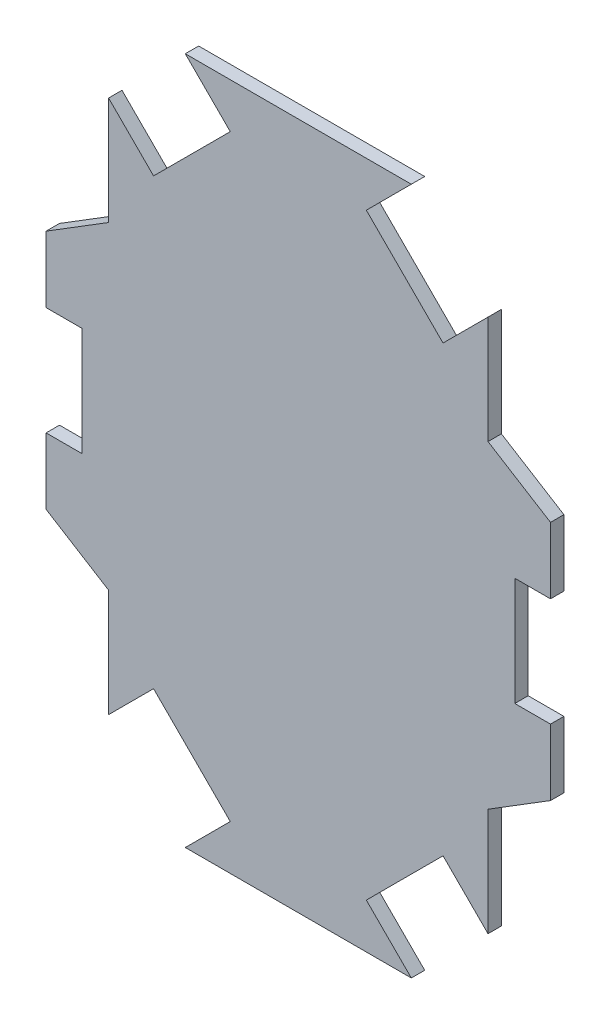
ISO-10303-21;
HEADER;
FILE_DESCRIPTION(('STEP AP214'),'2;1');
FILE_NAME('part.step','',(''),(''),'','','');
FILE_SCHEMA(('AUTOMOTIVE_DESIGN { 1 0 10303 214 1 1 1 1 }'));
ENDSEC;
DATA;
#1=APPLICATION_CONTEXT('core data for automotive mechanical design processes');
#2=APPLICATION_PROTOCOL_DEFINITION('international standard','automotive_design',2000,#1);
#3=PRODUCT_CONTEXT('',#1,'mechanical');
#4=PRODUCT('Part','Part','',(#3));
#5=PRODUCT_RELATED_PRODUCT_CATEGORY('part','',(#4));
#6=PRODUCT_DEFINITION_FORMATION('','',#4);
#7=PRODUCT_DEFINITION_CONTEXT('part definition',#1,'design');
#8=PRODUCT_DEFINITION('design','',#6,#7);
#9=PRODUCT_DEFINITION_SHAPE('','',#8);
#10=(LENGTH_UNIT() NAMED_UNIT(*) SI_UNIT(.MILLI.,.METRE.));
#11=(NAMED_UNIT(*) PLANE_ANGLE_UNIT() SI_UNIT($,.RADIAN.));
#12=(NAMED_UNIT(*) SI_UNIT($,.STERADIAN.) SOLID_ANGLE_UNIT());
#13=UNCERTAINTY_MEASURE_WITH_UNIT(LENGTH_MEASURE(1.E-05),#10,'distance_accuracy_value','');
#14=(GEOMETRIC_REPRESENTATION_CONTEXT(3) GLOBAL_UNCERTAINTY_ASSIGNED_CONTEXT((#13)) GLOBAL_UNIT_ASSIGNED_CONTEXT((#10,
#11,#12)) REPRESENTATION_CONTEXT('',''));
#15=CARTESIAN_POINT('',(0.,0.,0.));
#16=DIRECTION('',(0.,0.,1.));
#17=DIRECTION('',(1.,0.,0.));
#18=AXIS2_PLACEMENT_3D('',#15,#16,#17);
#19=CARTESIAN_POINT('',(99.,-50.0114282123653,0.));
#20=DIRECTION('',(1.,0.,0.));
#21=DIRECTION('',(0.,1.,0.));
#22=AXIS2_PLACEMENT_3D('',#19,#20,#21);
#23=PLANE('',#22);
#24=DIRECTION('',(0.,0.,1.));
#25=VECTOR('',#24,1.);
#26=CARTESIAN_POINT('',(99.,-64.85,0.));
#27=LINE('',#26,#25);
#28=CARTESIAN_POINT('',(99.,-64.85,0.));
#29=VERTEX_POINT('',#28);
#30=CARTESIAN_POINT('',(99.,-64.85,3.));
#31=VERTEX_POINT('',#30);
#32=EDGE_CURVE('E488',#29,#31,#27,.T.);
#33=ORIENTED_EDGE('',*,*,#32,.F.);
#34=DIRECTION('',(0.,1.,0.));
#35=VECTOR('',#34,1.);
#36=CARTESIAN_POINT('',(99.,-50.0114282123653,0.));
#37=LINE('',#36,#35);
#38=CARTESIAN_POINT('',(99.,-50.0114282123653,0.));
#39=VERTEX_POINT('',#38);
#40=EDGE_CURVE('E322',#29,#39,#37,.T.);
#41=ORIENTED_EDGE('',*,*,#40,.T.);
#42=DIRECTION('',(0.,0.,1.));
#43=VECTOR('',#42,1.);
#44=CARTESIAN_POINT('',(99.,-50.0114282123653,0.));
#45=LINE('',#44,#43);
#46=CARTESIAN_POINT('',(99.,-50.0114282123653,3.));
#47=VERTEX_POINT('',#46);
#48=EDGE_CURVE('E338',#39,#47,#45,.T.);
#49=ORIENTED_EDGE('',*,*,#48,.T.);
#50=DIRECTION('',(0.,1.,0.));
#51=VECTOR('',#50,1.);
#52=CARTESIAN_POINT('',(99.,-50.0114282123653,3.));
#53=LINE('',#52,#51);
#54=EDGE_CURVE('E331',#31,#47,#53,.T.);
#55=ORIENTED_EDGE('',*,*,#54,.F.);
#56=EDGE_LOOP('',(#33,#41,#49,#55));
#57=FACE_BOUND('',#56,.T.);
#58=ADVANCED_FACE('F35',(#57),#23,.T.);
#59=CARTESIAN_POINT('',(-14.,-50.0114282123653,0.));
#60=DIRECTION('',(-1.,0.,0.));
#61=DIRECTION('',(0.,0.,1.));
#62=AXIS2_PLACEMENT_3D('',#59,#60,#61);
#63=PLANE('',#62);
#64=DIRECTION('',(0.,0.,-1.));
#65=VECTOR('',#64,1.);
#66=CARTESIAN_POINT('',(-14.,-64.85,0.));
#67=LINE('',#66,#65);
#68=CARTESIAN_POINT('',(-14.,-64.85,3.));
#69=VERTEX_POINT('',#68);
#70=CARTESIAN_POINT('',(-14.,-64.85,0.));
#71=VERTEX_POINT('',#70);
#72=EDGE_CURVE('E484',#69,#71,#67,.T.);
#73=ORIENTED_EDGE('',*,*,#72,.F.);
#74=DIRECTION('',(0.,-1.,0.));
#75=VECTOR('',#74,1.);
#76=CARTESIAN_POINT('',(-14.,-50.0114282123653,3.));
#77=LINE('',#76,#75);
#78=CARTESIAN_POINT('',(-14.,-50.0114282123653,3.));
#79=VERTEX_POINT('',#78);
#80=EDGE_CURVE('E300',#79,#69,#77,.T.);
#81=ORIENTED_EDGE('',*,*,#80,.F.);
#82=DIRECTION('',(0.,0.,1.));
#83=VECTOR('',#82,1.);
#84=CARTESIAN_POINT('',(-14.,-50.0114282123653,0.));
#85=LINE('',#84,#83);
#86=CARTESIAN_POINT('',(-14.,-50.0114282123653,0.));
#87=VERTEX_POINT('',#86);
#88=EDGE_CURVE('E309',#87,#79,#85,.T.);
#89=ORIENTED_EDGE('',*,*,#88,.F.);
#90=DIRECTION('',(0.,-1.,0.));
#91=VECTOR('',#90,1.);
#92=CARTESIAN_POINT('',(-14.,-50.0114282123653,0.));
#93=LINE('',#92,#91);
#94=EDGE_CURVE('E290',#87,#71,#93,.T.);
#95=ORIENTED_EDGE('',*,*,#94,.T.);
#96=EDGE_LOOP('',(#73,#81,#89,#95));
#97=FACE_BOUND('',#96,.T.);
#98=ADVANCED_FACE('F508',(#97),#63,.T.);
#99=CARTESIAN_POINT('',(0.,0.,3.));
#100=DIRECTION('',(1.,0.,0.));
#101=DIRECTION('',(0.,1.,0.));
#102=AXIS2_PLACEMENT_3D('',#99,#100,#101);
#103=PLANE('',#102);
#104=DIRECTION('',(0.,0.,1.));
#105=VECTOR('',#104,1.);
#106=CARTESIAN_POINT('',(0.,-112.665382133312,0.));
#107=LINE('',#106,#105);
#108=CARTESIAN_POINT('',(0.,-112.665382133312,0.));
#109=VERTEX_POINT('',#108);
#110=CARTESIAN_POINT('',(0.,-112.665382133312,3.));
#111=VERTEX_POINT('',#110);
#112=EDGE_CURVE('E315',#109,#111,#107,.T.);
#113=ORIENTED_EDGE('',*,*,#112,.F.);
#114=DIRECTION('',(0.,-1.,0.));
#115=VECTOR('',#114,1.);
#116=CARTESIAN_POINT('',(0.,0.,0.));
#117=LINE('',#116,#115);
#118=CARTESIAN_POINT('',(0.,-136.817305217167,0.));
#119=VERTEX_POINT('',#118);
#120=EDGE_CURVE('E418',#109,#119,#117,.T.);
#121=ORIENTED_EDGE('',*,*,#120,.T.);
#122=DIRECTION('',(0.,0.,1.));
#123=VECTOR('',#122,1.);
#124=CARTESIAN_POINT('',(0.,-136.817305217167,3.));
#125=LINE('',#124,#123);
#126=CARTESIAN_POINT('',(0.,-136.817305217167,3.));
#127=VERTEX_POINT('',#126);
#128=EDGE_CURVE('E415',#119,#127,#125,.T.);
#129=ORIENTED_EDGE('',*,*,#128,.T.);
#130=DIRECTION('',(0.,-1.,0.));
#131=VECTOR('',#130,1.);
#132=CARTESIAN_POINT('',(0.,0.,3.));
#133=LINE('',#132,#131);
#134=EDGE_CURVE('E423',#111,#127,#133,.T.);
#135=ORIENTED_EDGE('',*,*,#134,.F.);
#136=EDGE_LOOP('',(#113,#121,#129,#135));
#137=FACE_BOUND('',#136,.T.);
#138=ADVANCED_FACE('F598',(#137),#103,.F.);
#139=CARTESIAN_POINT('',(85.,0.,3.));
#140=DIRECTION('',(-1.,0.,0.));
#141=DIRECTION('',(0.,-1.,0.));
#142=AXIS2_PLACEMENT_3D('',#139,#140,#141);
#143=PLANE('',#142);
#144=DIRECTION('',(0.,0.,1.));
#145=VECTOR('',#144,1.);
#146=CARTESIAN_POINT('',(85.,-41.3346178666883,0.));
#147=LINE('',#146,#145);
#148=CARTESIAN_POINT('',(85.,-41.3346178666883,0.));
#149=VERTEX_POINT('',#148);
#150=CARTESIAN_POINT('',(85.,-41.3346178666883,3.));
#151=VERTEX_POINT('',#150);
#152=EDGE_CURVE('E335',#149,#151,#147,.T.);
#153=ORIENTED_EDGE('',*,*,#152,.F.);
#154=DIRECTION('',(0.,1.,0.));
#155=VECTOR('',#154,1.);
#156=CARTESIAN_POINT('',(85.,0.,0.));
#157=LINE('',#156,#155);
#158=CARTESIAN_POINT('',(85.,-17.1826947828331,0.));
#159=VERTEX_POINT('',#158);
#160=EDGE_CURVE('E440',#149,#159,#157,.T.);
#161=ORIENTED_EDGE('',*,*,#160,.T.);
#162=DIRECTION('',(0.,0.,1.));
#163=VECTOR('',#162,1.);
#164=CARTESIAN_POINT('',(85.,-17.1826947828331,3.));
#165=LINE('',#164,#163);
#166=CARTESIAN_POINT('',(85.,-17.1826947828331,3.));
#167=VERTEX_POINT('',#166);
#168=EDGE_CURVE('E403',#159,#167,#165,.T.);
#169=ORIENTED_EDGE('',*,*,#168,.T.);
#170=DIRECTION('',(0.,1.,0.));
#171=VECTOR('',#170,1.);
#172=CARTESIAN_POINT('',(85.,0.,3.));
#173=LINE('',#172,#171);
#174=EDGE_CURVE('E426',#151,#167,#173,.T.);
#175=ORIENTED_EDGE('',*,*,#174,.F.);
#176=EDGE_LOOP('',(#153,#161,#169,#175));
#177=FACE_BOUND('',#176,.T.);
#178=ADVANCED_FACE('F546',(#177),#143,.F.);
#179=CARTESIAN_POINT('',(0.,-17.1826947828331,0.));
#180=VERTEX_POINT('',#179);
#181=CARTESIAN_POINT('',(0.,-41.3346178666882,0.));
#182=VERTEX_POINT('',#181);
#183=EDGE_CURVE('E434',#180,#182,#117,.T.);
#184=ORIENTED_EDGE('',*,*,#183,.T.);
#185=DIRECTION('',(0.,0.,1.));
#186=VECTOR('',#185,1.);
#187=CARTESIAN_POINT('',(0.,-41.3346178666882,0.));
#188=LINE('',#187,#186);
#189=CARTESIAN_POINT('',(0.,-41.3346178666882,3.));
#190=VERTEX_POINT('',#189);
#191=EDGE_CURVE('E312',#182,#190,#188,.T.);
#192=ORIENTED_EDGE('',*,*,#191,.T.);
#193=CARTESIAN_POINT('',(0.,-17.1826947828331,3.));
#194=VERTEX_POINT('',#193);
#195=EDGE_CURVE('E419',#194,#190,#133,.T.);
#196=ORIENTED_EDGE('',*,*,#195,.F.);
#197=DIRECTION('',(0.,0.,-1.));
#198=VECTOR('',#197,1.);
#199=CARTESIAN_POINT('',(0.,-17.1826947828331,3.));
#200=LINE('',#199,#198);
#201=EDGE_CURVE('E393',#194,#180,#200,.T.);
#202=ORIENTED_EDGE('',*,*,#201,.T.);
#203=EDGE_LOOP('',(#184,#192,#196,#202));
#204=FACE_BOUND('',#203,.T.);
#205=ADVANCED_FACE('F37',(#204),#103,.F.);
#206=CARTESIAN_POINT('',(0.,-154.,3.));
#207=DIRECTION('',(0.,1.,0.));
#208=DIRECTION('',(0.,0.,1.));
#209=AXIS2_PLACEMENT_3D('',#206,#207,#208);
#210=PLANE('',#209);
#211=DIRECTION('',(1.,0.,0.));
#212=VECTOR('',#211,1.);
#213=CARTESIAN_POINT('',(0.,-154.,3.));
#214=LINE('',#213,#212);
#215=CARTESIAN_POINT('',(17.1826947828331,-154.,3.));
#216=VERTEX_POINT('',#215);
#217=CARTESIAN_POINT('',(67.8173052171669,-154.,3.));
#218=VERTEX_POINT('',#217);
#219=EDGE_CURVE('E422',#216,#218,#214,.T.);
#220=ORIENTED_EDGE('',*,*,#219,.F.);
#221=DIRECTION('',(0.,0.,-1.));
#222=VECTOR('',#221,1.);
#223=CARTESIAN_POINT('',(17.1826947828331,-154.,3.));
#224=LINE('',#223,#222);
#225=CARTESIAN_POINT('',(17.1826947828331,-154.,0.));
#226=VERTEX_POINT('',#225);
#227=EDGE_CURVE('E412',#216,#226,#224,.T.);
#228=ORIENTED_EDGE('',*,*,#227,.T.);
#229=DIRECTION('',(1.,0.,0.));
#230=VECTOR('',#229,1.);
#231=CARTESIAN_POINT('',(0.,-154.,0.));
#232=LINE('',#231,#230);
#233=CARTESIAN_POINT('',(67.8173052171669,-154.,0.));
#234=VERTEX_POINT('',#233);
#235=EDGE_CURVE('E437',#226,#234,#232,.T.);
#236=ORIENTED_EDGE('',*,*,#235,.T.);
#237=DIRECTION('',(0.,0.,1.));
#238=VECTOR('',#237,1.);
#239=CARTESIAN_POINT('',(67.8173052171669,-154.,3.));
#240=LINE('',#239,#238);
#241=EDGE_CURVE('E406',#234,#218,#240,.T.);
#242=ORIENTED_EDGE('',*,*,#241,.T.);
#243=EDGE_LOOP('',(#220,#228,#236,#242));
#244=FACE_BOUND('',#243,.T.);
#245=ADVANCED_FACE('F580',(#244),#210,.F.);
#246=CARTESIAN_POINT('',(85.,-136.817305217167,0.));
#247=VERTEX_POINT('',#246);
#248=CARTESIAN_POINT('',(85.,-112.665382133312,0.));
#249=VERTEX_POINT('',#248);
#250=EDGE_CURVE('E441',#247,#249,#157,.T.);
#251=ORIENTED_EDGE('',*,*,#250,.T.);
#252=DIRECTION('',(0.,0.,1.));
#253=VECTOR('',#252,1.);
#254=CARTESIAN_POINT('',(85.,-112.665382133312,0.));
#255=LINE('',#254,#253);
#256=CARTESIAN_POINT('',(85.,-112.665382133312,3.));
#257=VERTEX_POINT('',#256);
#258=EDGE_CURVE('E329',#249,#257,#255,.T.);
#259=ORIENTED_EDGE('',*,*,#258,.T.);
#260=CARTESIAN_POINT('',(85.,-136.817305217167,3.));
#261=VERTEX_POINT('',#260);
#262=EDGE_CURVE('E427',#261,#257,#173,.T.);
#263=ORIENTED_EDGE('',*,*,#262,.F.);
#264=DIRECTION('',(0.,0.,-1.));
#265=VECTOR('',#264,1.);
#266=CARTESIAN_POINT('',(85.,-136.817305217167,3.));
#267=LINE('',#266,#265);
#268=EDGE_CURVE('E409',#261,#247,#267,.T.);
#269=ORIENTED_EDGE('',*,*,#268,.T.);
#270=EDGE_LOOP('',(#251,#259,#263,#269));
#271=FACE_BOUND('',#270,.T.);
#272=ADVANCED_FACE('F565',(#271),#143,.F.);
#273=CARTESIAN_POINT('',(0.,0.,3.));
#274=DIRECTION('',(0.,-1.,0.));
#275=DIRECTION('',(0.,0.,-1.));
#276=AXIS2_PLACEMENT_3D('',#273,#274,#275);
#277=PLANE('',#276);
#278=DIRECTION('',(-1.,0.,0.));
#279=VECTOR('',#278,1.);
#280=CARTESIAN_POINT('',(0.,0.,3.));
#281=LINE('',#280,#279);
#282=CARTESIAN_POINT('',(67.8173052171669,0.,3.));
#283=VERTEX_POINT('',#282);
#284=CARTESIAN_POINT('',(17.1826947828331,0.,3.));
#285=VERTEX_POINT('',#284);
#286=EDGE_CURVE('E430',#283,#285,#281,.T.);
#287=ORIENTED_EDGE('',*,*,#286,.F.);
#288=DIRECTION('',(0.,0.,-1.));
#289=VECTOR('',#288,1.);
#290=CARTESIAN_POINT('',(67.8173052171669,0.,3.));
#291=LINE('',#290,#289);
#292=CARTESIAN_POINT('',(67.8173052171669,0.,0.));
#293=VERTEX_POINT('',#292);
#294=EDGE_CURVE('E400',#283,#293,#291,.T.);
#295=ORIENTED_EDGE('',*,*,#294,.T.);
#296=DIRECTION('',(-1.,0.,0.));
#297=VECTOR('',#296,1.);
#298=CARTESIAN_POINT('',(0.,0.,0.));
#299=LINE('',#298,#297);
#300=CARTESIAN_POINT('',(17.1826947828331,0.,0.));
#301=VERTEX_POINT('',#300);
#302=EDGE_CURVE('E444',#293,#301,#299,.T.);
#303=ORIENTED_EDGE('',*,*,#302,.T.);
#304=DIRECTION('',(0.,0.,1.));
#305=VECTOR('',#304,1.);
#306=CARTESIAN_POINT('',(17.1826947828331,0.,3.));
#307=LINE('',#306,#305);
#308=EDGE_CURVE('E397',#301,#285,#307,.T.);
#309=ORIENTED_EDGE('',*,*,#308,.T.);
#310=EDGE_LOOP('',(#287,#295,#303,#309));
#311=FACE_BOUND('',#310,.T.);
#312=ADVANCED_FACE('F529',(#311),#277,.F.);
#313=CARTESIAN_POINT('',(0.,0.,3.));
#314=DIRECTION('',(0.,0.,1.));
#315=DIRECTION('',(1.,0.,0.));
#316=AXIS2_PLACEMENT_3D('',#313,#314,#315);
#317=PLANE('',#316);
#318=DIRECTION('',(-1.,0.,0.));
#319=VECTOR('',#318,1.);
#320=CARTESIAN_POINT('',(91.,-64.85,3.));
#321=LINE('',#320,#319);
#322=CARTESIAN_POINT('',(91.,-64.85,3.));
#323=VERTEX_POINT('',#322);
#324=EDGE_CURVE('E250',#31,#323,#321,.T.);
#325=ORIENTED_EDGE('',*,*,#324,.F.);
#326=ORIENTED_EDGE('',*,*,#54,.T.);
#327=DIRECTION('',(-0.849989408173799,0.526799777897025,0.));
#328=VECTOR('',#327,1.);
#329=CARTESIAN_POINT('',(85.,-41.3346178666883,3.));
#330=LINE('',#329,#328);
#331=EDGE_CURVE('E323',#47,#151,#330,.T.);
#332=ORIENTED_EDGE('',*,*,#331,.T.);
#333=ORIENTED_EDGE('',*,*,#174,.T.);
#334=DIRECTION('',(0.707106781186547,0.707106781186549,0.));
#335=VECTOR('',#334,1.);
#336=CARTESIAN_POINT('',(74.9237283680917,-27.2589664147414,3.));
#337=LINE('',#336,#335);
#338=CARTESIAN_POINT('',(74.9237283680917,-27.2589664147414,3.));
#339=VERTEX_POINT('',#338);
#340=EDGE_CURVE('E337',#339,#167,#337,.T.);
#341=ORIENTED_EDGE('',*,*,#340,.F.);
#342=DIRECTION('',(0.707106781186547,-0.707106781186548,0.));
#343=VECTOR('',#342,1.);
#344=CARTESIAN_POINT('',(74.9237283680917,-27.2589664147414,3.));
#345=LINE('',#344,#343);
#346=CARTESIAN_POINT('',(57.7410335852586,-10.0762716319083,3.));
#347=VERTEX_POINT('',#346);
#348=EDGE_CURVE('E377',#347,#339,#345,.T.);
#349=ORIENTED_EDGE('',*,*,#348,.F.);
#350=DIRECTION('',(-0.707106781186548,-0.707106781186548,0.));
#351=VECTOR('',#350,1.);
#352=CARTESIAN_POINT('',(89.1365746699414,21.3192694527744,3.));
#353=LINE('',#352,#351);
#354=EDGE_CURVE('E374',#283,#347,#353,.T.);
#355=ORIENTED_EDGE('',*,*,#354,.F.);
#356=ORIENTED_EDGE('',*,*,#286,.T.);
#357=DIRECTION('',(-0.707106781186548,0.707106781186548,0.));
#358=VECTOR('',#357,1.);
#359=CARTESIAN_POINT('',(-4.13657466994131,21.3192694527744,3.));
#360=LINE('',#359,#358);
#361=CARTESIAN_POINT('',(27.2589664147414,-10.0762716319083,3.));
#362=VERTEX_POINT('',#361);
#363=EDGE_CURVE('E358',#362,#285,#360,.T.);
#364=ORIENTED_EDGE('',*,*,#363,.F.);
#365=DIRECTION('',(0.707106781186547,0.707106781186548,0.));
#366=VECTOR('',#365,1.);
#367=CARTESIAN_POINT('',(10.0762716319083,-27.2589664147414,3.));
#368=LINE('',#367,#366);
#369=CARTESIAN_POINT('',(10.0762716319083,-27.2589664147414,3.));
#370=VERTEX_POINT('',#369);
#371=EDGE_CURVE('E387',#370,#362,#368,.T.);
#372=ORIENTED_EDGE('',*,*,#371,.F.);
#373=DIRECTION('',(0.707106781186547,-0.707106781186547,0.));
#374=VECTOR('',#373,1.);
#375=CARTESIAN_POINT('',(10.0762716319083,-27.2589664147414,3.));
#376=LINE('',#375,#374);
#377=EDGE_CURVE('E384',#194,#370,#376,.T.);
#378=ORIENTED_EDGE('',*,*,#377,.F.);
#379=ORIENTED_EDGE('',*,*,#195,.T.);
#380=DIRECTION('',(-0.849989408173799,-0.526799777897025,0.));
#381=VECTOR('',#380,1.);
#382=CARTESIAN_POINT('',(0.,-41.3346178666882,3.));
#383=LINE('',#382,#381);
#384=EDGE_CURVE('E306',#190,#79,#383,.T.);
#385=ORIENTED_EDGE('',*,*,#384,.T.);
#386=ORIENTED_EDGE('',*,*,#80,.T.);
#387=DIRECTION('',(-1.,0.,0.));
#388=VECTOR('',#387,1.);
#389=CARTESIAN_POINT('',(-6.00000000000002,-64.85,3.));
#390=LINE('',#389,#388);
#391=CARTESIAN_POINT('',(-6.00000000000002,-64.85,3.));
#392=VERTEX_POINT('',#391);
#393=EDGE_CURVE('E270',#392,#69,#390,.T.);
#394=ORIENTED_EDGE('',*,*,#393,.F.);
#395=DIRECTION('',(0.,1.,0.));
#396=VECTOR('',#395,1.);
#397=CARTESIAN_POINT('',(-6.00000000000002,-64.85,3.));
#398=LINE('',#397,#396);
#399=CARTESIAN_POINT('',(-6.00000000000002,-89.15,3.));
#400=VERTEX_POINT('',#399);
#401=EDGE_CURVE('E275',#400,#392,#398,.T.);
#402=ORIENTED_EDGE('',*,*,#401,.F.);
#403=DIRECTION('',(1.,0.,0.));
#404=VECTOR('',#403,1.);
#405=CARTESIAN_POINT('',(-6.00000000000002,-89.15,3.));
#406=LINE('',#405,#404);
#407=CARTESIAN_POINT('',(-14.,-89.15,3.));
#408=VERTEX_POINT('',#407);
#409=EDGE_CURVE('E272',#408,#400,#406,.T.);
#410=ORIENTED_EDGE('',*,*,#409,.F.);
#411=CARTESIAN_POINT('',(-14.,-103.988571787635,3.));
#412=VERTEX_POINT('',#411);
#413=EDGE_CURVE('E289',#408,#412,#77,.T.);
#414=ORIENTED_EDGE('',*,*,#413,.T.);
#415=DIRECTION('',(0.8499894081738,-0.526799777897024,0.));
#416=VECTOR('',#415,1.);
#417=CARTESIAN_POINT('',(-14.,-103.988571787635,3.));
#418=LINE('',#417,#416);
#419=EDGE_CURVE('E303',#412,#111,#418,.T.);
#420=ORIENTED_EDGE('',*,*,#419,.T.);
#421=ORIENTED_EDGE('',*,*,#134,.T.);
#422=DIRECTION('',(-0.707106781186548,-0.707106781186547,0.));
#423=VECTOR('',#422,1.);
#424=CARTESIAN_POINT('',(10.0762716319083,-126.741033585259,3.));
#425=LINE('',#424,#423);
#426=CARTESIAN_POINT('',(10.0762716319083,-126.741033585259,3.));
#427=VERTEX_POINT('',#426);
#428=EDGE_CURVE('E345',#427,#127,#425,.T.);
#429=ORIENTED_EDGE('',*,*,#428,.F.);
#430=DIRECTION('',(-0.707106781186548,0.707106781186547,0.));
#431=VECTOR('',#430,1.);
#432=CARTESIAN_POINT('',(10.0762716319083,-126.741033585259,3.));
#433=LINE('',#432,#431);
#434=CARTESIAN_POINT('',(27.2589664147414,-143.923728368092,3.));
#435=VERTEX_POINT('',#434);
#436=EDGE_CURVE('E352',#435,#427,#433,.T.);
#437=ORIENTED_EDGE('',*,*,#436,.F.);
#438=DIRECTION('',(0.707106781186548,0.707106781186547,0.));
#439=VECTOR('',#438,1.);
#440=CARTESIAN_POINT('',(-4.13657466994131,-175.319269452774,3.));
#441=LINE('',#440,#439);
#442=EDGE_CURVE('E348',#216,#435,#441,.T.);
#443=ORIENTED_EDGE('',*,*,#442,.F.);
#444=ORIENTED_EDGE('',*,*,#219,.T.);
#445=DIRECTION('',(0.707106781186548,-0.707106781186547,0.));
#446=VECTOR('',#445,1.);
#447=CARTESIAN_POINT('',(89.1365746699413,-175.319269452774,3.));
#448=LINE('',#447,#446);
#449=CARTESIAN_POINT('',(57.7410335852586,-143.923728368092,3.));
#450=VERTEX_POINT('',#449);
#451=EDGE_CURVE('E363',#450,#218,#448,.T.);
#452=ORIENTED_EDGE('',*,*,#451,.F.);
#453=DIRECTION('',(-0.707106781186548,-0.707106781186548,0.));
#454=VECTOR('',#453,1.);
#455=CARTESIAN_POINT('',(74.9237283680917,-126.741033585259,3.));
#456=LINE('',#455,#454);
#457=CARTESIAN_POINT('',(74.9237283680917,-126.741033585259,3.));
#458=VERTEX_POINT('',#457);
#459=EDGE_CURVE('E360',#458,#450,#456,.T.);
#460=ORIENTED_EDGE('',*,*,#459,.F.);
#461=DIRECTION('',(-0.707106781186548,0.707106781186547,0.));
#462=VECTOR('',#461,1.);
#463=CARTESIAN_POINT('',(74.9237283680917,-126.741033585259,3.));
#464=LINE('',#463,#462);
#465=EDGE_CURVE('E366',#261,#458,#464,.T.);
#466=ORIENTED_EDGE('',*,*,#465,.F.);
#467=ORIENTED_EDGE('',*,*,#262,.T.);
#468=DIRECTION('',(0.8499894081738,0.526799777897024,0.));
#469=VECTOR('',#468,1.);
#470=CARTESIAN_POINT('',(99.,-103.988571787635,3.));
#471=LINE('',#470,#469);
#472=CARTESIAN_POINT('',(99.,-103.988571787635,3.));
#473=VERTEX_POINT('',#472);
#474=EDGE_CURVE('E311',#257,#473,#471,.T.);
#475=ORIENTED_EDGE('',*,*,#474,.T.);
#476=CARTESIAN_POINT('',(99.,-89.15,3.));
#477=VERTEX_POINT('',#476);
#478=EDGE_CURVE('E265',#473,#477,#53,.T.);
#479=ORIENTED_EDGE('',*,*,#478,.T.);
#480=DIRECTION('',(1.,0.,0.));
#481=VECTOR('',#480,1.);
#482=CARTESIAN_POINT('',(91.,-89.15,3.));
#483=LINE('',#482,#481);
#484=CARTESIAN_POINT('',(91.,-89.15,3.));
#485=VERTEX_POINT('',#484);
#486=EDGE_CURVE('E50',#485,#477,#483,.T.);
#487=ORIENTED_EDGE('',*,*,#486,.F.);
#488=DIRECTION('',(0.,-1.,0.));
#489=VECTOR('',#488,1.);
#490=CARTESIAN_POINT('',(91.,-64.85,3.));
#491=LINE('',#490,#489);
#492=EDGE_CURVE('E253',#323,#485,#491,.T.);
#493=ORIENTED_EDGE('',*,*,#492,.F.);
#494=EDGE_LOOP('',(#325,#326,#332,#333,#341,#349,#355,#356,#364,#372,#378,#379,#385,#386,#394,
#402,#410,#414,#420,#421,#429,#437,#443,#444,#452,#460,#466,#467,#475,#479,#487,#493));
#495=FACE_BOUND('',#494,.T.);
#496=ADVANCED_FACE('F262',(#495),#317,.T.);
#497=CARTESIAN_POINT('',(0.,0.,0.));
#498=DIRECTION('',(0.,0.,1.));
#499=DIRECTION('',(1.,0.,0.));
#500=AXIS2_PLACEMENT_3D('',#497,#498,#499);
#501=PLANE('',#500);
#502=ORIENTED_EDGE('',*,*,#40,.F.);
#503=DIRECTION('',(-1.,0.,0.));
#504=VECTOR('',#503,1.);
#505=CARTESIAN_POINT('',(0.,-64.85,0.));
#506=LINE('',#505,#504);
#507=CARTESIAN_POINT('',(91.,-64.85,0.));
#508=VERTEX_POINT('',#507);
#509=EDGE_CURVE('E286',#29,#508,#506,.T.);
#510=ORIENTED_EDGE('',*,*,#509,.T.);
#511=DIRECTION('',(0.,-1.,0.));
#512=VECTOR('',#511,1.);
#513=CARTESIAN_POINT('',(91.,0.,0.));
#514=LINE('',#513,#512);
#515=CARTESIAN_POINT('',(91.,-89.15,0.));
#516=VERTEX_POINT('',#515);
#517=EDGE_CURVE('E11',#508,#516,#514,.T.);
#518=ORIENTED_EDGE('',*,*,#517,.T.);
#519=DIRECTION('',(1.,0.,0.));
#520=VECTOR('',#519,1.);
#521=CARTESIAN_POINT('',(0.,-89.15,0.));
#522=LINE('',#521,#520);
#523=CARTESIAN_POINT('',(99.,-89.15,0.));
#524=VERTEX_POINT('',#523);
#525=EDGE_CURVE('E247',#516,#524,#522,.T.);
#526=ORIENTED_EDGE('',*,*,#525,.T.);
#527=CARTESIAN_POINT('',(99.,-103.988571787635,0.));
#528=VERTEX_POINT('',#527);
#529=EDGE_CURVE('E324',#528,#524,#37,.T.);
#530=ORIENTED_EDGE('',*,*,#529,.F.);
#531=DIRECTION('',(0.8499894081738,0.526799777897024,0.));
#532=VECTOR('',#531,1.);
#533=CARTESIAN_POINT('',(99.,-103.988571787635,0.));
#534=LINE('',#533,#532);
#535=EDGE_CURVE('E319',#249,#528,#534,.T.);
#536=ORIENTED_EDGE('',*,*,#535,.F.);
#537=ORIENTED_EDGE('',*,*,#250,.F.);
#538=DIRECTION('',(-0.707106781186548,0.707106781186547,0.));
#539=VECTOR('',#538,1.);
#540=CARTESIAN_POINT('',(-25.9086526085835,-25.9086526085835,0.));
#541=LINE('',#540,#539);
#542=CARTESIAN_POINT('',(74.9237283680917,-126.741033585259,0.));
#543=VERTEX_POINT('',#542);
#544=EDGE_CURVE('E470',#247,#543,#541,.T.);
#545=ORIENTED_EDGE('',*,*,#544,.T.);
#546=DIRECTION('',(-0.707106781186548,-0.707106781186548,0.));
#547=VECTOR('',#546,1.);
#548=CARTESIAN_POINT('',(100.832380976675,-100.832380976675,0.));
#549=LINE('',#548,#547);
#550=CARTESIAN_POINT('',(57.7410335852586,-143.923728368092,0.));
#551=VERTEX_POINT('',#550);
#552=EDGE_CURVE('E467',#543,#551,#549,.T.);
#553=ORIENTED_EDGE('',*,*,#552,.T.);
#554=DIRECTION('',(0.707106781186548,-0.707106781186547,0.));
#555=VECTOR('',#554,1.);
#556=CARTESIAN_POINT('',(-43.0913473914166,-43.0913473914166,0.));
#557=LINE('',#556,#555);
#558=EDGE_CURVE('E464',#551,#234,#557,.T.);
#559=ORIENTED_EDGE('',*,*,#558,.T.);
#560=ORIENTED_EDGE('',*,*,#235,.F.);
#561=DIRECTION('',(0.707106781186548,0.707106781186547,0.));
#562=VECTOR('',#561,1.);
#563=CARTESIAN_POINT('',(85.5913473914165,-85.5913473914166,0.));
#564=LINE('',#563,#562);
#565=CARTESIAN_POINT('',(27.2589664147414,-143.923728368092,0.));
#566=VERTEX_POINT('',#565);
#567=EDGE_CURVE('E473',#226,#566,#564,.T.);
#568=ORIENTED_EDGE('',*,*,#567,.T.);
#569=DIRECTION('',(-0.707106781186548,0.707106781186547,0.));
#570=VECTOR('',#569,1.);
#571=CARTESIAN_POINT('',(-58.3323809766752,-58.3323809766753,0.));
#572=LINE('',#571,#570);
#573=CARTESIAN_POINT('',(10.0762716319083,-126.741033585259,0.));
#574=VERTEX_POINT('',#573);
#575=EDGE_CURVE('E476',#566,#574,#572,.T.);
#576=ORIENTED_EDGE('',*,*,#575,.T.);
#577=DIRECTION('',(-0.707106781186548,-0.707106781186547,0.));
#578=VECTOR('',#577,1.);
#579=CARTESIAN_POINT('',(68.4086526085835,-68.4086526085836,0.));
#580=LINE('',#579,#578);
#581=EDGE_CURVE('E479',#574,#119,#580,.T.);
#582=ORIENTED_EDGE('',*,*,#581,.T.);
#583=ORIENTED_EDGE('',*,*,#120,.F.);
#584=DIRECTION('',(0.8499894081738,-0.526799777897024,0.));
#585=VECTOR('',#584,1.);
#586=CARTESIAN_POINT('',(-14.,-103.988571787635,0.));
#587=LINE('',#586,#585);
#588=CARTESIAN_POINT('',(-14.,-103.988571787635,0.));
#589=VERTEX_POINT('',#588);
#590=EDGE_CURVE('E293',#589,#109,#587,.T.);
#591=ORIENTED_EDGE('',*,*,#590,.F.);
#592=CARTESIAN_POINT('',(-14.,-89.15,0.));
#593=VERTEX_POINT('',#592);
#594=EDGE_CURVE('E294',#593,#589,#93,.T.);
#595=ORIENTED_EDGE('',*,*,#594,.F.);
#596=DIRECTION('',(1.,0.,0.));
#597=VECTOR('',#596,1.);
#598=CARTESIAN_POINT('',(0.,-89.15,0.));
#599=LINE('',#598,#597);
#600=CARTESIAN_POINT('',(-6.00000000000002,-89.15,0.));
#601=VERTEX_POINT('',#600);
#602=EDGE_CURVE('E58',#593,#601,#599,.T.);
#603=ORIENTED_EDGE('',*,*,#602,.T.);
#604=DIRECTION('',(0.,1.,0.));
#605=VECTOR('',#604,1.);
#606=CARTESIAN_POINT('',(-6.00000000000003,0.,0.));
#607=LINE('',#606,#605);
#608=CARTESIAN_POINT('',(-6.00000000000002,-64.85,0.));
#609=VERTEX_POINT('',#608);
#610=EDGE_CURVE('E43',#601,#609,#607,.T.);
#611=ORIENTED_EDGE('',*,*,#610,.T.);
#612=DIRECTION('',(-1.,0.,0.));
#613=VECTOR('',#612,1.);
#614=CARTESIAN_POINT('',(0.,-64.85,0.));
#615=LINE('',#614,#613);
#616=EDGE_CURVE('E282',#609,#71,#615,.T.);
#617=ORIENTED_EDGE('',*,*,#616,.T.);
#618=ORIENTED_EDGE('',*,*,#94,.F.);
#619=DIRECTION('',(-0.849989408173799,-0.526799777897025,0.));
#620=VECTOR('',#619,1.);
#621=CARTESIAN_POINT('',(0.,-41.3346178666882,0.));
#622=LINE('',#621,#620);
#623=EDGE_CURVE('E296',#182,#87,#622,.T.);
#624=ORIENTED_EDGE('',*,*,#623,.F.);
#625=ORIENTED_EDGE('',*,*,#183,.F.);
#626=DIRECTION('',(0.707106781186548,-0.707106781186548,0.));
#627=VECTOR('',#626,1.);
#628=CARTESIAN_POINT('',(-8.59134739141655,-8.59134739141655,0.));
#629=LINE('',#628,#627);
#630=CARTESIAN_POINT('',(10.0762716319083,-27.2589664147414,0.));
#631=VERTEX_POINT('',#630);
#632=EDGE_CURVE('E433',#180,#631,#629,.T.);
#633=ORIENTED_EDGE('',*,*,#632,.T.);
#634=DIRECTION('',(0.707106781186547,0.707106781186548,0.));
#635=VECTOR('',#634,1.);
#636=CARTESIAN_POINT('',(18.6676190233249,-18.6676190233248,0.));
#637=LINE('',#636,#635);
#638=CARTESIAN_POINT('',(27.2589664147414,-10.0762716319083,0.));
#639=VERTEX_POINT('',#638);
#640=EDGE_CURVE('E449',#631,#639,#637,.T.);
#641=ORIENTED_EDGE('',*,*,#640,.T.);
#642=DIRECTION('',(-0.707106781186548,0.707106781186548,0.));
#643=VECTOR('',#642,1.);
#644=CARTESIAN_POINT('',(8.59134739141656,8.59134739141656,0.));
#645=LINE('',#644,#643);
#646=EDGE_CURVE('E452',#639,#301,#645,.T.);
#647=ORIENTED_EDGE('',*,*,#646,.T.);
#648=ORIENTED_EDGE('',*,*,#302,.F.);
#649=DIRECTION('',(-0.707106781186548,-0.707106781186548,0.));
#650=VECTOR('',#649,1.);
#651=CARTESIAN_POINT('',(33.9086526085835,-33.9086526085835,0.));
#652=LINE('',#651,#650);
#653=CARTESIAN_POINT('',(57.7410335852586,-10.0762716319083,0.));
#654=VERTEX_POINT('',#653);
#655=EDGE_CURVE('E455',#293,#654,#652,.T.);
#656=ORIENTED_EDGE('',*,*,#655,.T.);
#657=DIRECTION('',(0.707106781186547,-0.707106781186548,0.));
#658=VECTOR('',#657,1.);
#659=CARTESIAN_POINT('',(23.8323809766752,23.8323809766752,0.));
#660=LINE('',#659,#658);
#661=CARTESIAN_POINT('',(74.9237283680917,-27.2589664147414,0.));
#662=VERTEX_POINT('',#661);
#663=EDGE_CURVE('E458',#654,#662,#660,.T.);
#664=ORIENTED_EDGE('',*,*,#663,.T.);
#665=DIRECTION('',(0.707106781186546,0.707106781186549,0.));
#666=VECTOR('',#665,1.);
#667=CARTESIAN_POINT('',(51.0913473914167,-51.0913473914165,0.));
#668=LINE('',#667,#666);
#669=EDGE_CURVE('E461',#662,#159,#668,.T.);
#670=ORIENTED_EDGE('',*,*,#669,.T.);
#671=ORIENTED_EDGE('',*,*,#160,.F.);
#672=DIRECTION('',(-0.849989408173799,0.526799777897025,0.));
#673=VECTOR('',#672,1.);
#674=CARTESIAN_POINT('',(85.,-41.3346178666883,0.));
#675=LINE('',#674,#673);
#676=EDGE_CURVE('E327',#39,#149,#675,.T.);
#677=ORIENTED_EDGE('',*,*,#676,.F.);
#678=EDGE_LOOP('',(#502,#510,#518,#526,#530,#536,#537,#545,#553,#559,#560,#568,#576,#582,#583,
#591,#595,#603,#611,#617,#618,#624,#625,#633,#641,#647,#648,#656,#664,#670,#671,#677));
#679=FACE_BOUND('',#678,.T.);
#680=ADVANCED_FACE('F492',(#679),#501,.F.);
#681=CARTESIAN_POINT('',(-4.13657466994131,21.3192694527744,-55.));
#682=DIRECTION('',(0.707106781186548,0.707106781186548,0.));
#683=DIRECTION('',(-0.707106781186548,0.707106781186548,0.));
#684=AXIS2_PLACEMENT_3D('',#681,#682,#683);
#685=PLANE('',#684);
#686=ORIENTED_EDGE('',*,*,#646,.F.);
#687=DIRECTION('',(0.,0.,1.));
#688=VECTOR('',#687,1.);
#689=CARTESIAN_POINT('',(27.2589664147414,-10.0762716319083,-55.));
#690=LINE('',#689,#688);
#691=EDGE_CURVE('E391',#639,#362,#690,.T.);
#692=ORIENTED_EDGE('',*,*,#691,.T.);
#693=ORIENTED_EDGE('',*,*,#363,.T.);
#694=ORIENTED_EDGE('',*,*,#308,.F.);
#695=EDGE_LOOP('',(#686,#692,#693,#694));
#696=FACE_BOUND('',#695,.T.);
#697=ADVANCED_FACE('F526',(#696),#685,.F.);
#698=CARTESIAN_POINT('',(10.0762716319083,-27.2589664147414,-55.));
#699=DIRECTION('',(0.707106781186548,-0.707106781186547,0.));
#700=DIRECTION('',(0.707106781186547,0.707106781186548,0.));
#701=AXIS2_PLACEMENT_3D('',#698,#699,#700);
#702=PLANE('',#701);
#703=DIRECTION('',(0.,0.,1.));
#704=VECTOR('',#703,1.);
#705=CARTESIAN_POINT('',(10.0762716319083,-27.2589664147414,-55.));
#706=LINE('',#705,#704);
#707=EDGE_CURVE('E390',#631,#370,#706,.T.);
#708=ORIENTED_EDGE('',*,*,#707,.T.);
#709=ORIENTED_EDGE('',*,*,#371,.T.);
#710=ORIENTED_EDGE('',*,*,#691,.F.);
#711=ORIENTED_EDGE('',*,*,#640,.F.);
#712=EDGE_LOOP('',(#708,#709,#710,#711));
#713=FACE_BOUND('',#712,.T.);
#714=ADVANCED_FACE('F524',(#713),#702,.F.);
#715=CARTESIAN_POINT('',(10.0762716319083,-27.2589664147414,-55.));
#716=DIRECTION('',(-0.707106781186547,-0.707106781186547,0.));
#717=DIRECTION('',(0.707106781186548,-0.707106781186548,0.));
#718=AXIS2_PLACEMENT_3D('',#715,#716,#717);
#719=PLANE('',#718);
#720=ORIENTED_EDGE('',*,*,#377,.T.);
#721=ORIENTED_EDGE('',*,*,#707,.F.);
#722=ORIENTED_EDGE('',*,*,#632,.F.);
#723=ORIENTED_EDGE('',*,*,#201,.F.);
#724=EDGE_LOOP('',(#720,#721,#722,#723));
#725=FACE_BOUND('',#724,.T.);
#726=ADVANCED_FACE('F519',(#725),#719,.F.);
#727=CARTESIAN_POINT('',(74.9237283680917,-27.2589664147414,-55.));
#728=DIRECTION('',(0.707106781186549,-0.707106781186547,0.));
#729=DIRECTION('',(0.707106781186546,0.707106781186549,0.));
#730=AXIS2_PLACEMENT_3D('',#727,#728,#729);
#731=PLANE('',#730);
#732=ORIENTED_EDGE('',*,*,#669,.F.);
#733=DIRECTION('',(0.,0.,1.));
#734=VECTOR('',#733,1.);
#735=CARTESIAN_POINT('',(74.9237283680917,-27.2589664147414,-55.));
#736=LINE('',#735,#734);
#737=EDGE_CURVE('E364',#662,#339,#736,.T.);
#738=ORIENTED_EDGE('',*,*,#737,.T.);
#739=ORIENTED_EDGE('',*,*,#340,.T.);
#740=ORIENTED_EDGE('',*,*,#168,.F.);
#741=EDGE_LOOP('',(#732,#738,#739,#740));
#742=FACE_BOUND('',#741,.T.);
#743=ADVANCED_FACE('F541',(#742),#731,.F.);
#744=CARTESIAN_POINT('',(74.9237283680917,-27.2589664147414,-55.));
#745=DIRECTION('',(-0.707106781186548,-0.707106781186547,0.));
#746=DIRECTION('',(0.707106781186547,-0.707106781186548,0.));
#747=AXIS2_PLACEMENT_3D('',#744,#745,#746);
#748=PLANE('',#747);
#749=DIRECTION('',(0.,0.,1.));
#750=VECTOR('',#749,1.);
#751=CARTESIAN_POINT('',(57.7410335852586,-10.0762716319083,-55.));
#752=LINE('',#751,#750);
#753=EDGE_CURVE('E380',#654,#347,#752,.T.);
#754=ORIENTED_EDGE('',*,*,#753,.T.);
#755=ORIENTED_EDGE('',*,*,#348,.T.);
#756=ORIENTED_EDGE('',*,*,#737,.F.);
#757=ORIENTED_EDGE('',*,*,#663,.F.);
#758=EDGE_LOOP('',(#754,#755,#756,#757));
#759=FACE_BOUND('',#758,.T.);
#760=ADVANCED_FACE('F539',(#759),#748,.F.);
#761=CARTESIAN_POINT('',(89.1365746699414,21.3192694527744,-55.));
#762=DIRECTION('',(-0.707106781186548,0.707106781186548,0.));
#763=DIRECTION('',(-0.707106781186548,-0.707106781186548,0.));
#764=AXIS2_PLACEMENT_3D('',#761,#762,#763);
#765=PLANE('',#764);
#766=ORIENTED_EDGE('',*,*,#354,.T.);
#767=ORIENTED_EDGE('',*,*,#753,.F.);
#768=ORIENTED_EDGE('',*,*,#655,.F.);
#769=ORIENTED_EDGE('',*,*,#294,.F.);
#770=EDGE_LOOP('',(#766,#767,#768,#769));
#771=FACE_BOUND('',#770,.T.);
#772=ADVANCED_FACE('F534',(#771),#765,.F.);
#773=CARTESIAN_POINT('',(74.9237283680917,-126.741033585259,-55.));
#774=DIRECTION('',(-0.707106781186548,0.707106781186548,0.));
#775=DIRECTION('',(-0.707106781186548,-0.707106781186548,0.));
#776=AXIS2_PLACEMENT_3D('',#773,#774,#775);
#777=PLANE('',#776);
#778=DIRECTION('',(0.,0.,1.));
#779=VECTOR('',#778,1.);
#780=CARTESIAN_POINT('',(74.9237283680917,-126.741033585259,-55.));
#781=LINE('',#780,#779);
#782=EDGE_CURVE('E349',#543,#458,#781,.T.);
#783=ORIENTED_EDGE('',*,*,#782,.T.);
#784=ORIENTED_EDGE('',*,*,#459,.T.);
#785=DIRECTION('',(0.,0.,1.));
#786=VECTOR('',#785,1.);
#787=CARTESIAN_POINT('',(57.7410335852586,-143.923728368092,-55.));
#788=LINE('',#787,#786);
#789=EDGE_CURVE('E369',#551,#450,#788,.T.);
#790=ORIENTED_EDGE('',*,*,#789,.F.);
#791=ORIENTED_EDGE('',*,*,#552,.F.);
#792=EDGE_LOOP('',(#783,#784,#790,#791));
#793=FACE_BOUND('',#792,.T.);
#794=ADVANCED_FACE('F575',(#793),#777,.F.);
#795=CARTESIAN_POINT('',(74.9237283680917,-126.741033585259,-55.));
#796=DIRECTION('',(0.707106781186547,0.707106781186548,0.));
#797=DIRECTION('',(-0.707106781186548,0.707106781186547,0.));
#798=AXIS2_PLACEMENT_3D('',#795,#796,#797);
#799=PLANE('',#798);
#800=ORIENTED_EDGE('',*,*,#465,.T.);
#801=ORIENTED_EDGE('',*,*,#782,.F.);
#802=ORIENTED_EDGE('',*,*,#544,.F.);
#803=ORIENTED_EDGE('',*,*,#268,.F.);
#804=EDGE_LOOP('',(#800,#801,#802,#803));
#805=FACE_BOUND('',#804,.T.);
#806=ADVANCED_FACE('F569',(#805),#799,.F.);
#807=CARTESIAN_POINT('',(89.1365746699413,-175.319269452774,-55.));
#808=DIRECTION('',(-0.707106781186547,-0.707106781186548,0.));
#809=DIRECTION('',(0.707106781186548,-0.707106781186547,0.));
#810=AXIS2_PLACEMENT_3D('',#807,#808,#809);
#811=PLANE('',#810);
#812=ORIENTED_EDGE('',*,*,#558,.F.);
#813=ORIENTED_EDGE('',*,*,#789,.T.);
#814=ORIENTED_EDGE('',*,*,#451,.T.);
#815=ORIENTED_EDGE('',*,*,#241,.F.);
#816=EDGE_LOOP('',(#812,#813,#814,#815));
#817=FACE_BOUND('',#816,.T.);
#818=ADVANCED_FACE('F635',(#817),#811,.F.);
#819=CARTESIAN_POINT('',(10.0762716319083,-126.741033585259,-55.));
#820=DIRECTION('',(-0.707106781186547,0.707106781186548,0.));
#821=DIRECTION('',(-0.707106781186548,-0.707106781186547,0.));
#822=AXIS2_PLACEMENT_3D('',#819,#820,#821);
#823=PLANE('',#822);
#824=ORIENTED_EDGE('',*,*,#581,.F.);
#825=DIRECTION('',(0.,0.,1.));
#826=VECTOR('',#825,1.);
#827=CARTESIAN_POINT('',(10.0762716319083,-126.741033585259,-55.));
#828=LINE('',#827,#826);
#829=EDGE_CURVE('E356',#574,#427,#828,.T.);
#830=ORIENTED_EDGE('',*,*,#829,.T.);
#831=ORIENTED_EDGE('',*,*,#428,.T.);
#832=ORIENTED_EDGE('',*,*,#128,.F.);
#833=EDGE_LOOP('',(#824,#830,#831,#832));
#834=FACE_BOUND('',#833,.T.);
#835=ADVANCED_FACE('F594',(#834),#823,.F.);
#836=CARTESIAN_POINT('',(10.0762716319083,-126.741033585259,-55.));
#837=DIRECTION('',(0.707106781186547,0.707106781186548,0.));
#838=DIRECTION('',(-0.707106781186548,0.707106781186547,0.));
#839=AXIS2_PLACEMENT_3D('',#836,#837,#838);
#840=PLANE('',#839);
#841=DIRECTION('',(0.,0.,1.));
#842=VECTOR('',#841,1.);
#843=CARTESIAN_POINT('',(27.2589664147414,-143.923728368092,-55.));
#844=LINE('',#843,#842);
#845=EDGE_CURVE('E355',#566,#435,#844,.T.);
#846=ORIENTED_EDGE('',*,*,#845,.T.);
#847=ORIENTED_EDGE('',*,*,#436,.T.);
#848=ORIENTED_EDGE('',*,*,#829,.F.);
#849=ORIENTED_EDGE('',*,*,#575,.F.);
#850=EDGE_LOOP('',(#846,#847,#848,#849));
#851=FACE_BOUND('',#850,.T.);
#852=ADVANCED_FACE('F588',(#851),#840,.F.);
#853=CARTESIAN_POINT('',(-4.13657466994131,-175.319269452774,-55.));
#854=DIRECTION('',(0.707106781186547,-0.707106781186548,0.));
#855=DIRECTION('',(0.707106781186548,0.707106781186547,0.));
#856=AXIS2_PLACEMENT_3D('',#853,#854,#855);
#857=PLANE('',#856);
#858=ORIENTED_EDGE('',*,*,#442,.T.);
#859=ORIENTED_EDGE('',*,*,#845,.F.);
#860=ORIENTED_EDGE('',*,*,#567,.F.);
#861=ORIENTED_EDGE('',*,*,#227,.F.);
#862=EDGE_LOOP('',(#858,#859,#860,#861));
#863=FACE_BOUND('',#862,.T.);
#864=ADVANCED_FACE('F583',(#863),#857,.F.);
#865=CARTESIAN_POINT('',(85.,-41.3346178666883,0.));
#866=DIRECTION('',(0.526799777897025,0.849989408173799,0.));
#867=DIRECTION('',(-0.849989408173799,0.526799777897025,0.));
#868=AXIS2_PLACEMENT_3D('',#865,#866,#867);
#869=PLANE('',#868);
#870=ORIENTED_EDGE('',*,*,#331,.F.);
#871=ORIENTED_EDGE('',*,*,#48,.F.);
#872=ORIENTED_EDGE('',*,*,#676,.T.);
#873=ORIENTED_EDGE('',*,*,#152,.T.);
#874=EDGE_LOOP('',(#870,#871,#872,#873));
#875=FACE_BOUND('',#874,.T.);
#876=ADVANCED_FACE('F551',(#875),#869,.T.);
#877=DIRECTION('',(0.,0.,-1.));
#878=VECTOR('',#877,1.);
#879=CARTESIAN_POINT('',(99.,-89.15,0.));
#880=LINE('',#879,#878);
#881=EDGE_CURVE('E486',#477,#524,#880,.T.);
#882=ORIENTED_EDGE('',*,*,#881,.F.);
#883=ORIENTED_EDGE('',*,*,#478,.F.);
#884=DIRECTION('',(0.,0.,1.));
#885=VECTOR('',#884,1.);
#886=CARTESIAN_POINT('',(99.,-103.988571787635,0.));
#887=LINE('',#886,#885);
#888=EDGE_CURVE('E341',#528,#473,#887,.T.);
#889=ORIENTED_EDGE('',*,*,#888,.F.);
#890=ORIENTED_EDGE('',*,*,#529,.T.);
#891=EDGE_LOOP('',(#882,#883,#889,#890));
#892=FACE_BOUND('',#891,.T.);
#893=ADVANCED_FACE('F560',(#892),#23,.T.);
#894=CARTESIAN_POINT('',(99.,-103.988571787635,0.));
#895=DIRECTION('',(0.526799777897024,-0.849989408173799,0.));
#896=DIRECTION('',(0.8499894081738,0.526799777897024,0.));
#897=AXIS2_PLACEMENT_3D('',#894,#895,#896);
#898=PLANE('',#897);
#899=ORIENTED_EDGE('',*,*,#474,.F.);
#900=ORIENTED_EDGE('',*,*,#258,.F.);
#901=ORIENTED_EDGE('',*,*,#535,.T.);
#902=ORIENTED_EDGE('',*,*,#888,.T.);
#903=EDGE_LOOP('',(#899,#900,#901,#902));
#904=FACE_BOUND('',#903,.T.);
#905=ADVANCED_FACE('F562',(#904),#898,.T.);
#906=DIRECTION('',(0.,0.,1.));
#907=VECTOR('',#906,1.);
#908=CARTESIAN_POINT('',(-14.,-89.15,0.));
#909=LINE('',#908,#907);
#910=EDGE_CURVE('E482',#593,#408,#909,.T.);
#911=ORIENTED_EDGE('',*,*,#910,.F.);
#912=ORIENTED_EDGE('',*,*,#594,.T.);
#913=DIRECTION('',(0.,0.,1.));
#914=VECTOR('',#913,1.);
#915=CARTESIAN_POINT('',(-14.,-103.988571787635,0.));
#916=LINE('',#915,#914);
#917=EDGE_CURVE('E299',#589,#412,#916,.T.);
#918=ORIENTED_EDGE('',*,*,#917,.T.);
#919=ORIENTED_EDGE('',*,*,#413,.F.);
#920=EDGE_LOOP('',(#911,#912,#918,#919));
#921=FACE_BOUND('',#920,.T.);
#922=ADVANCED_FACE('F604',(#921),#63,.T.);
#923=CARTESIAN_POINT('',(0.,-41.3346178666882,0.));
#924=DIRECTION('',(-0.526799777897025,0.849989408173799,0.));
#925=DIRECTION('',(-0.849989408173799,-0.526799777897025,0.));
#926=AXIS2_PLACEMENT_3D('',#923,#924,#925);
#927=PLANE('',#926);
#928=ORIENTED_EDGE('',*,*,#384,.F.);
#929=ORIENTED_EDGE('',*,*,#191,.F.);
#930=ORIENTED_EDGE('',*,*,#623,.T.);
#931=ORIENTED_EDGE('',*,*,#88,.T.);
#932=EDGE_LOOP('',(#928,#929,#930,#931));
#933=FACE_BOUND('',#932,.T.);
#934=ADVANCED_FACE('F512',(#933),#927,.T.);
#935=CARTESIAN_POINT('',(-14.,-103.988571787635,0.));
#936=DIRECTION('',(-0.526799777897024,-0.849989408173799,0.));
#937=DIRECTION('',(0.8499894081738,-0.526799777897024,0.));
#938=AXIS2_PLACEMENT_3D('',#935,#936,#937);
#939=PLANE('',#938);
#940=ORIENTED_EDGE('',*,*,#419,.F.);
#941=ORIENTED_EDGE('',*,*,#917,.F.);
#942=ORIENTED_EDGE('',*,*,#590,.T.);
#943=ORIENTED_EDGE('',*,*,#112,.T.);
#944=EDGE_LOOP('',(#940,#941,#942,#943));
#945=FACE_BOUND('',#944,.T.);
#946=ADVANCED_FACE('F601',(#945),#939,.T.);
#947=CARTESIAN_POINT('',(-6.00000000000002,-64.85,-55.));
#948=DIRECTION('',(1.,0.,0.));
#949=DIRECTION('',(0.,1.,0.));
#950=AXIS2_PLACEMENT_3D('',#947,#948,#949);
#951=PLANE('',#950);
#952=DIRECTION('',(0.,0.,1.));
#953=VECTOR('',#952,1.);
#954=CARTESIAN_POINT('',(-6.00000000000002,-89.15,-55.));
#955=LINE('',#954,#953);
#956=EDGE_CURVE('E278',#601,#400,#955,.T.);
#957=ORIENTED_EDGE('',*,*,#956,.T.);
#958=ORIENTED_EDGE('',*,*,#401,.T.);
#959=DIRECTION('',(0.,0.,1.));
#960=VECTOR('',#959,1.);
#961=CARTESIAN_POINT('',(-6.00000000000002,-64.85,-55.));
#962=LINE('',#961,#960);
#963=EDGE_CURVE('E259',#609,#392,#962,.T.);
#964=ORIENTED_EDGE('',*,*,#963,.F.);
#965=ORIENTED_EDGE('',*,*,#610,.F.);
#966=EDGE_LOOP('',(#957,#958,#964,#965));
#967=FACE_BOUND('',#966,.T.);
#968=ADVANCED_FACE('F497',(#967),#951,.F.);
#969=CARTESIAN_POINT('',(-6.00000000000002,-64.85,-55.));
#970=DIRECTION('',(0.,1.,0.));
#971=DIRECTION('',(-1.,0.,0.));
#972=AXIS2_PLACEMENT_3D('',#969,#970,#971);
#973=PLANE('',#972);
#974=ORIENTED_EDGE('',*,*,#963,.T.);
#975=ORIENTED_EDGE('',*,*,#393,.T.);
#976=ORIENTED_EDGE('',*,*,#72,.T.);
#977=ORIENTED_EDGE('',*,*,#616,.F.);
#978=EDGE_LOOP('',(#974,#975,#976,#977));
#979=FACE_BOUND('',#978,.T.);
#980=ADVANCED_FACE('F506',(#979),#973,.F.);
#981=CARTESIAN_POINT('',(-6.00000000000002,-89.15,-55.));
#982=DIRECTION('',(0.,-1.,0.));
#983=DIRECTION('',(1.,0.,0.));
#984=AXIS2_PLACEMENT_3D('',#981,#982,#983);
#985=PLANE('',#984);
#986=ORIENTED_EDGE('',*,*,#910,.T.);
#987=ORIENTED_EDGE('',*,*,#409,.T.);
#988=ORIENTED_EDGE('',*,*,#956,.F.);
#989=ORIENTED_EDGE('',*,*,#602,.F.);
#990=EDGE_LOOP('',(#986,#987,#988,#989));
#991=FACE_BOUND('',#990,.T.);
#992=ADVANCED_FACE('F498',(#991),#985,.F.);
#993=CARTESIAN_POINT('',(91.,-64.85,-55.));
#994=DIRECTION('',(-1.,0.,0.));
#995=DIRECTION('',(0.,0.,1.));
#996=AXIS2_PLACEMENT_3D('',#993,#994,#995);
#997=PLANE('',#996);
#998=DIRECTION('',(0.,0.,1.));
#999=VECTOR('',#998,1.);
#1000=CARTESIAN_POINT('',(91.,-64.85,-55.));
#1001=LINE('',#1000,#999);
#1002=EDGE_CURVE('E249',#508,#323,#1001,.T.);
#1003=ORIENTED_EDGE('',*,*,#1002,.T.);
#1004=ORIENTED_EDGE('',*,*,#492,.T.);
#1005=DIRECTION('',(0.,0.,1.));
#1006=VECTOR('',#1005,1.);
#1007=CARTESIAN_POINT('',(91.,-89.15,-55.));
#1008=LINE('',#1007,#1006);
#1009=EDGE_CURVE('E243',#516,#485,#1008,.T.);
#1010=ORIENTED_EDGE('',*,*,#1009,.F.);
#1011=ORIENTED_EDGE('',*,*,#517,.F.);
#1012=EDGE_LOOP('',(#1003,#1004,#1010,#1011));
#1013=FACE_BOUND('',#1012,.T.);
#1014=ADVANCED_FACE('F254',(#1013),#997,.F.);
#1015=CARTESIAN_POINT('',(91.,-64.85,-55.));
#1016=DIRECTION('',(0.,1.,0.));
#1017=DIRECTION('',(0.,0.,1.));
#1018=AXIS2_PLACEMENT_3D('',#1015,#1016,#1017);
#1019=PLANE('',#1018);
#1020=ORIENTED_EDGE('',*,*,#32,.T.);
#1021=ORIENTED_EDGE('',*,*,#324,.T.);
#1022=ORIENTED_EDGE('',*,*,#1002,.F.);
#1023=ORIENTED_EDGE('',*,*,#509,.F.);
#1024=EDGE_LOOP('',(#1020,#1021,#1022,#1023));
#1025=FACE_BOUND('',#1024,.T.);
#1026=ADVANCED_FACE('F556',(#1025),#1019,.F.);
#1027=CARTESIAN_POINT('',(91.,-89.15,-55.));
#1028=DIRECTION('',(0.,-1.,0.));
#1029=DIRECTION('',(1.,0.,0.));
#1030=AXIS2_PLACEMENT_3D('',#1027,#1028,#1029);
#1031=PLANE('',#1030);
#1032=ORIENTED_EDGE('',*,*,#1009,.T.);
#1033=ORIENTED_EDGE('',*,*,#486,.T.);
#1034=ORIENTED_EDGE('',*,*,#881,.T.);
#1035=ORIENTED_EDGE('',*,*,#525,.F.);
#1036=EDGE_LOOP('',(#1032,#1033,#1034,#1035));
#1037=FACE_BOUND('',#1036,.T.);
#1038=ADVANCED_FACE('F245',(#1037),#1031,.F.);
#1039=CLOSED_SHELL('',(#58,#98,#138,#178,#205,#245,#272,#312,#496,#680,#697,#714,#726,#743,#760,
#772,#794,#806,#818,#835,#852,#864,#876,#893,#905,#922,#934,#946,#968,#980,#992,#1014,#1026,#1038));
#1040=MANIFOLD_SOLID_BREP('B2',#1039);
#1041=ADVANCED_BREP_SHAPE_REPRESENTATION('',(#18,#1040),#14);
#1042=SHAPE_DEFINITION_REPRESENTATION(#9,#1041);
ENDSEC;
END-ISO-10303-21;
